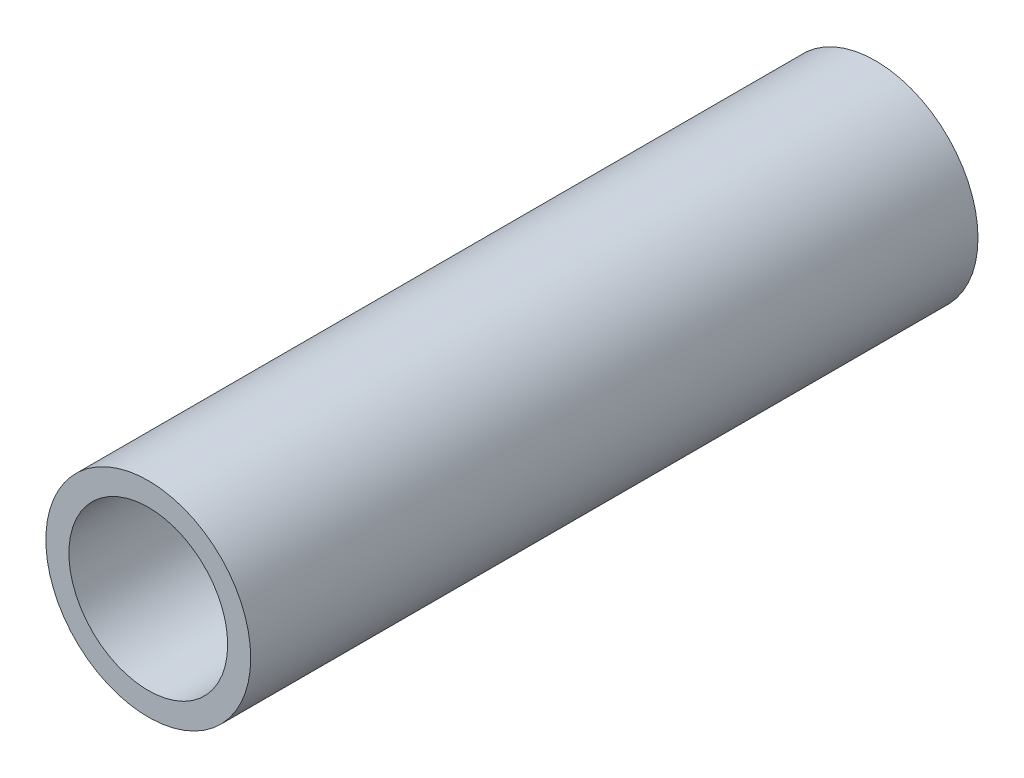
ISO-10303-21;
HEADER;
FILE_DESCRIPTION(('STEP AP214'),'2;1');
FILE_NAME('part.step','',(''),(''),'','','');
FILE_SCHEMA(('AUTOMOTIVE_DESIGN { 1 0 10303 214 1 1 1 1 }'));
ENDSEC;
DATA;
#1=APPLICATION_CONTEXT('core data for automotive mechanical design processes');
#2=APPLICATION_PROTOCOL_DEFINITION('international standard','automotive_design',2000,#1);
#3=PRODUCT_CONTEXT('',#1,'mechanical');
#4=PRODUCT('Part','Part','',(#3));
#5=PRODUCT_RELATED_PRODUCT_CATEGORY('part','',(#4));
#6=PRODUCT_DEFINITION_FORMATION('','',#4);
#7=PRODUCT_DEFINITION_CONTEXT('part definition',#1,'design');
#8=PRODUCT_DEFINITION('design','',#6,#7);
#9=PRODUCT_DEFINITION_SHAPE('','',#8);
#10=(LENGTH_UNIT() NAMED_UNIT(*) SI_UNIT(.MILLI.,.METRE.));
#11=(NAMED_UNIT(*) PLANE_ANGLE_UNIT() SI_UNIT($,.RADIAN.));
#12=(NAMED_UNIT(*) SI_UNIT($,.STERADIAN.) SOLID_ANGLE_UNIT());
#13=UNCERTAINTY_MEASURE_WITH_UNIT(LENGTH_MEASURE(1.E-05),#10,'distance_accuracy_value','');
#14=(GEOMETRIC_REPRESENTATION_CONTEXT(3) GLOBAL_UNCERTAINTY_ASSIGNED_CONTEXT((#13)) GLOBAL_UNIT_ASSIGNED_CONTEXT((#10,
#11,#12)) REPRESENTATION_CONTEXT('',''));
#15=CARTESIAN_POINT('',(0.,0.,0.));
#16=DIRECTION('',(0.,0.,1.));
#17=DIRECTION('',(1.,0.,0.));
#18=AXIS2_PLACEMENT_3D('',#15,#16,#17);
#19=CARTESIAN_POINT('',(0.,0.,7.1));
#20=DIRECTION('',(0.,0.,1.));
#21=DIRECTION('',(1.,0.,0.));
#22=AXIS2_PLACEMENT_3D('',#19,#20,#21);
#23=PLANE('',#22);
#24=CARTESIAN_POINT('',(0.,0.,7.1));
#25=DIRECTION('',(0.,0.,1.));
#26=DIRECTION('',(1.,0.,0.));
#27=AXIS2_PLACEMENT_3D('',#24,#25,#26);
#28=CIRCLE('',#27,1.);
#29=CARTESIAN_POINT('',(1.,0.,7.1));
#30=VERTEX_POINT('',#29);
#31=EDGE_CURVE('E10',#30,#30,#28,.T.);
#32=ORIENTED_EDGE('',*,*,#31,.T.);
#33=EDGE_LOOP('',(#32));
#34=FACE_BOUND('',#33,.T.);
#35=CARTESIAN_POINT('',(0.,0.,7.1));
#36=DIRECTION('',(0.,0.,1.));
#37=DIRECTION('',(1.,0.,0.));
#38=AXIS2_PLACEMENT_3D('',#35,#36,#37);
#39=CIRCLE('',#38,0.775);
#40=CARTESIAN_POINT('',(0.775,0.,7.1));
#41=VERTEX_POINT('',#40);
#42=EDGE_CURVE('E46',#41,#41,#39,.T.);
#43=ORIENTED_EDGE('',*,*,#42,.F.);
#44=EDGE_LOOP('',(#43));
#45=FACE_BOUND('',#44,.T.);
#46=ADVANCED_FACE('F35',(#34,#45),#23,.T.);
#47=CARTESIAN_POINT('',(0.,0.,0.));
#48=DIRECTION('',(0.,0.,1.));
#49=DIRECTION('',(1.,0.,0.));
#50=AXIS2_PLACEMENT_3D('',#47,#48,#49);
#51=PLANE('',#50);
#52=CARTESIAN_POINT('',(0.,0.,0.));
#53=DIRECTION('',(0.,0.,1.));
#54=DIRECTION('',(1.,0.,0.));
#55=AXIS2_PLACEMENT_3D('',#52,#53,#54);
#56=CIRCLE('',#55,1.);
#57=CARTESIAN_POINT('',(1.,0.,0.));
#58=VERTEX_POINT('',#57);
#59=EDGE_CURVE('E39',#58,#58,#56,.T.);
#60=ORIENTED_EDGE('',*,*,#59,.F.);
#61=EDGE_LOOP('',(#60));
#62=FACE_BOUND('',#61,.T.);
#63=CARTESIAN_POINT('',(0.,0.,0.));
#64=DIRECTION('',(0.,0.,1.));
#65=DIRECTION('',(1.,0.,0.));
#66=AXIS2_PLACEMENT_3D('',#63,#64,#65);
#67=CIRCLE('',#66,0.775);
#68=CARTESIAN_POINT('',(0.775,0.,0.));
#69=VERTEX_POINT('',#68);
#70=EDGE_CURVE('E48',#69,#69,#67,.T.);
#71=ORIENTED_EDGE('',*,*,#70,.T.);
#72=EDGE_LOOP('',(#71));
#73=FACE_BOUND('',#72,.T.);
#74=ADVANCED_FACE('F58',(#62,#73),#51,.F.);
#75=CARTESIAN_POINT('',(0.,0.,7.1));
#76=DIRECTION('',(0.,0.,-1.));
#77=DIRECTION('',(-1.,0.,0.));
#78=AXIS2_PLACEMENT_3D('',#75,#76,#77);
#79=CYLINDRICAL_SURFACE('',#78,1.);
#80=ORIENTED_EDGE('',*,*,#31,.F.);
#81=EDGE_LOOP('',(#80));
#82=FACE_BOUND('',#81,.T.);
#83=ORIENTED_EDGE('',*,*,#59,.T.);
#84=EDGE_LOOP('',(#83));
#85=FACE_BOUND('',#84,.T.);
#86=ADVANCED_FACE('F37',(#82,#85),#79,.T.);
#87=CARTESIAN_POINT('',(0.,0.,7.1));
#88=DIRECTION('',(0.,0.,-1.));
#89=DIRECTION('',(-1.,0.,0.));
#90=AXIS2_PLACEMENT_3D('',#87,#88,#89);
#91=CYLINDRICAL_SURFACE('',#90,0.775);
#92=ORIENTED_EDGE('',*,*,#42,.T.);
#93=EDGE_LOOP('',(#92));
#94=FACE_BOUND('',#93,.T.);
#95=ORIENTED_EDGE('',*,*,#70,.F.);
#96=EDGE_LOOP('',(#95));
#97=FACE_BOUND('',#96,.T.);
#98=ADVANCED_FACE('F54',(#94,#97),#91,.F.);
#99=CLOSED_SHELL('',(#46,#74,#86,#98));
#100=MANIFOLD_SOLID_BREP('B2',#99);
#101=ADVANCED_BREP_SHAPE_REPRESENTATION('',(#18,#100),#14);
#102=SHAPE_DEFINITION_REPRESENTATION(#9,#101);
ENDSEC;
END-ISO-10303-21;
